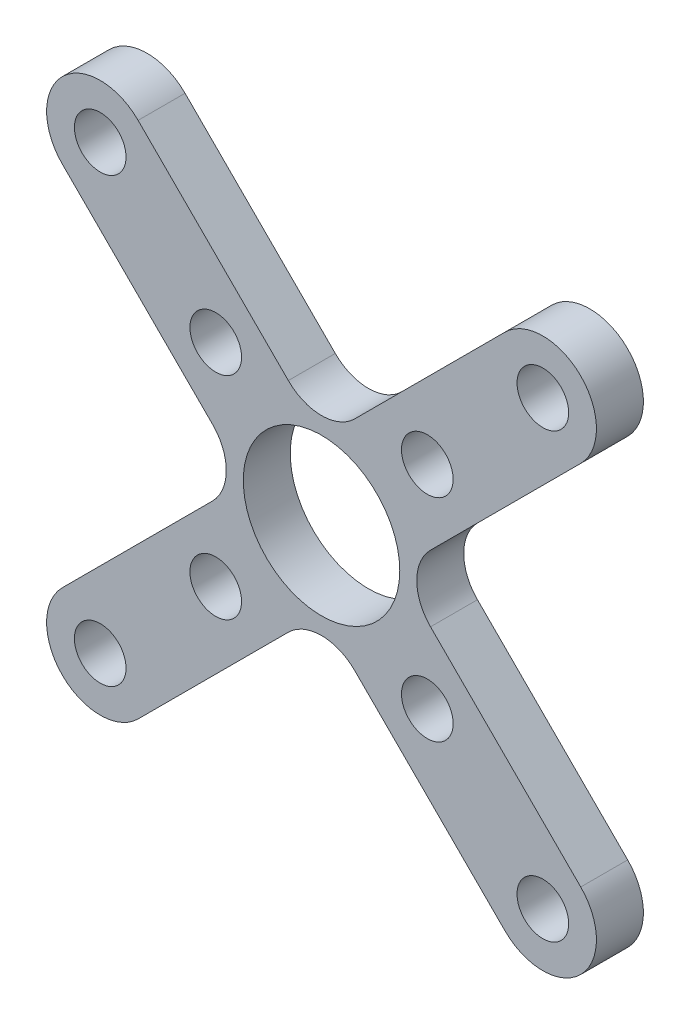
ISO-10303-21;
HEADER;
FILE_DESCRIPTION(('STEP AP214'),'2;1');
FILE_NAME('part.step','',(''),(''),'','','');
FILE_SCHEMA(('AUTOMOTIVE_DESIGN { 1 0 10303 214 1 1 1 1 }'));
ENDSEC;
DATA;
#1=APPLICATION_CONTEXT('core data for automotive mechanical design processes');
#2=APPLICATION_PROTOCOL_DEFINITION('international standard','automotive_design',2000,#1);
#3=PRODUCT_CONTEXT('',#1,'mechanical');
#4=PRODUCT('Part','Part','',(#3));
#5=PRODUCT_RELATED_PRODUCT_CATEGORY('part','',(#4));
#6=PRODUCT_DEFINITION_FORMATION('','',#4);
#7=PRODUCT_DEFINITION_CONTEXT('part definition',#1,'design');
#8=PRODUCT_DEFINITION('design','',#6,#7);
#9=PRODUCT_DEFINITION_SHAPE('','',#8);
#10=(LENGTH_UNIT() NAMED_UNIT(*) SI_UNIT(.MILLI.,.METRE.));
#11=(NAMED_UNIT(*) PLANE_ANGLE_UNIT() SI_UNIT($,.RADIAN.));
#12=(NAMED_UNIT(*) SI_UNIT($,.STERADIAN.) SOLID_ANGLE_UNIT());
#13=UNCERTAINTY_MEASURE_WITH_UNIT(LENGTH_MEASURE(1.E-05),#10,'distance_accuracy_value','');
#14=(GEOMETRIC_REPRESENTATION_CONTEXT(3) GLOBAL_UNCERTAINTY_ASSIGNED_CONTEXT((#13)) GLOBAL_UNIT_ASSIGNED_CONTEXT((#10,
#11,#12)) REPRESENTATION_CONTEXT('',''));
#15=CARTESIAN_POINT('',(0.,0.,0.));
#16=DIRECTION('',(0.,0.,1.));
#17=DIRECTION('',(1.,0.,0.));
#18=AXIS2_PLACEMENT_3D('',#15,#16,#17);
#19=CARTESIAN_POINT('',(-9.08524209264177,0.,3.));
#20=DIRECTION('',(0.,0.,-1.));
#21=DIRECTION('',(-1.,0.,0.));
#22=AXIS2_PLACEMENT_3D('',#19,#20,#21);
#23=PLANE('',#22);
#24=CARTESIAN_POINT('',(-6.75987434706719,-6.75987434706728,3.));
#25=DIRECTION('',(0.,0.,-1.));
#26=DIRECTION('',(-1.,0.,0.));
#27=AXIS2_PLACEMENT_3D('',#24,#25,#26);
#28=CIRCLE('',#27,1.65);
#29=CARTESIAN_POINT('',(-8.40987434706719,-6.75987434706728,3.));
#30=VERTEX_POINT('',#29);
#31=EDGE_CURVE('E820',#30,#30,#28,.T.);
#32=ORIENTED_EDGE('',*,*,#31,.T.);
#33=EDGE_LOOP('',(#32));
#34=FACE_BOUND('',#33,.T.);
#35=CARTESIAN_POINT('',(6.75987434706719,6.75987434706728,3.));
#36=DIRECTION('',(0.,0.,-1.));
#37=DIRECTION('',(-1.,0.,0.));
#38=AXIS2_PLACEMENT_3D('',#35,#36,#37);
#39=CIRCLE('',#38,1.65);
#40=CARTESIAN_POINT('',(5.10987434706719,6.75987434706728,3.));
#41=VERTEX_POINT('',#40);
#42=EDGE_CURVE('E834',#41,#41,#39,.T.);
#43=ORIENTED_EDGE('',*,*,#42,.T.);
#44=EDGE_LOOP('',(#43));
#45=FACE_BOUND('',#44,.T.);
#46=CARTESIAN_POINT('',(-9.08524209264177,0.,3.));
#47=DIRECTION('',(0.,0.,-1.));
#48=DIRECTION('',(-1.,0.,0.));
#49=AXIS2_PLACEMENT_3D('',#46,#47,#48);
#50=CIRCLE('',#49,3.);
#51=CARTESIAN_POINT('',(-6.96392174908201,2.12132034355962,3.));
#52=VERTEX_POINT('',#51);
#53=CARTESIAN_POINT('',(-6.9639217490821,-2.12132034355954,3.));
#54=VERTEX_POINT('',#53);
#55=EDGE_CURVE('E681',#52,#54,#50,.T.);
#56=ORIENTED_EDGE('',*,*,#55,.T.);
#57=DIRECTION('',(-0.707106781186541,-0.707106781186554,0.));
#58=VECTOR('',#57,1.);
#59=CARTESIAN_POINT('',(-6.9639217490821,-2.12132034355954,3.));
#60=LINE('',#59,#58);
#61=CARTESIAN_POINT('',(-16.5634363264922,-11.7208349209698,3.));
#62=VERTEX_POINT('',#61);
#63=EDGE_CURVE('E578',#54,#62,#60,.T.);
#64=ORIENTED_EDGE('',*,*,#63,.T.);
#65=CARTESIAN_POINT('',(-14.142135623731,-14.1421356237309,3.));
#66=DIRECTION('',(0.,0.,1.));
#67=DIRECTION('',(1.,0.,0.));
#68=AXIS2_PLACEMENT_3D('',#65,#66,#67);
#69=CIRCLE('',#68,3.42423629242906);
#70=CARTESIAN_POINT('',(-11.720833187446,-16.563434592968,3.));
#71=VERTEX_POINT('',#70);
#72=EDGE_CURVE('E713',#62,#71,#69,.T.);
#73=ORIENTED_EDGE('',*,*,#72,.T.);
#74=DIRECTION('',(-0.70710678118655,-0.707106781186545,0.));
#75=VECTOR('',#74,1.);
#76=CARTESIAN_POINT('',(-2.12132034355975,-6.96392174908287,3.));
#77=LINE('',#76,#75);
#78=CARTESIAN_POINT('',(-2.12132034355975,-6.96392174908287,3.));
#79=VERTEX_POINT('',#78);
#80=EDGE_CURVE('E726',#79,#71,#77,.T.);
#81=ORIENTED_EDGE('',*,*,#80,.F.);
#82=CARTESIAN_POINT('',(-1.11240012301255E-13,-9.08524209264252,3.));
#83=DIRECTION('',(0.,0.,-1.));
#84=DIRECTION('',(-1.,0.,0.));
#85=AXIS2_PLACEMENT_3D('',#82,#83,#84);
#86=CIRCLE('',#85,3.);
#87=CARTESIAN_POINT('',(2.12132034355965,-6.96392174908299,3.));
#88=VERTEX_POINT('',#87);
#89=EDGE_CURVE('E727',#79,#88,#86,.T.);
#90=ORIENTED_EDGE('',*,*,#89,.T.);
#91=DIRECTION('',(0.707106781186511,-0.707106781186584,0.));
#92=VECTOR('',#91,1.);
#93=CARTESIAN_POINT('',(2.12132034355965,-6.96392174908299,3.));
#94=LINE('',#93,#92);
#95=CARTESIAN_POINT('',(11.7208331874448,-16.5634345929691,3.));
#96=VERTEX_POINT('',#95);
#97=EDGE_CURVE('E729',#88,#96,#94,.T.);
#98=ORIENTED_EDGE('',*,*,#97,.T.);
#99=CARTESIAN_POINT('',(14.1421338902071,-14.1421338902071,3.));
#100=DIRECTION('',(0.,0.,-1.));
#101=DIRECTION('',(-1.,0.,0.));
#102=AXIS2_PLACEMENT_3D('',#99,#100,#101);
#103=CIRCLE('',#102,3.42423629242974);
#104=CARTESIAN_POINT('',(16.5634345929691,-11.7208331874449,3.));
#105=VERTEX_POINT('',#104);
#106=EDGE_CURVE('E735',#105,#96,#103,.T.);
#107=ORIENTED_EDGE('',*,*,#106,.F.);
#108=DIRECTION('',(0.70710678118658,-0.707106781186515,0.));
#109=VECTOR('',#108,1.);
#110=CARTESIAN_POINT('',(6.963921749083,-2.12132034355965,3.));
#111=LINE('',#110,#109);
#112=CARTESIAN_POINT('',(6.963921749083,-2.12132034355965,3.));
#113=VERTEX_POINT('',#112);
#114=EDGE_CURVE('E738',#113,#105,#111,.T.);
#115=ORIENTED_EDGE('',*,*,#114,.F.);
#116=CARTESIAN_POINT('',(9.08524209264255,1.01235817185007E-13,3.));
#117=DIRECTION('',(0.,0.,-1.));
#118=DIRECTION('',(-1.,0.,0.));
#119=AXIS2_PLACEMENT_3D('',#116,#117,#118);
#120=CIRCLE('',#119,3.00000000000001);
#121=CARTESIAN_POINT('',(6.96392174908291,2.12132034355976,3.));
#122=VERTEX_POINT('',#121);
#123=EDGE_CURVE('E741',#113,#122,#120,.T.);
#124=ORIENTED_EDGE('',*,*,#123,.T.);
#125=DIRECTION('',(-0.70710678118655,-0.707106781186545,0.));
#126=VECTOR('',#125,1.);
#127=CARTESIAN_POINT('',(16.5634345929686,11.7208331874454,3.));
#128=LINE('',#127,#126);
#129=CARTESIAN_POINT('',(16.5634345929686,11.7208331874454,3.));
#130=VERTEX_POINT('',#129);
#131=EDGE_CURVE('E743',#130,#122,#128,.T.);
#132=ORIENTED_EDGE('',*,*,#131,.F.);
#133=CARTESIAN_POINT('',(14.142135623731,14.1421356237309,3.));
#134=DIRECTION('',(0.,0.,1.));
#135=DIRECTION('',(1.,0.,0.));
#136=AXIS2_PLACEMENT_3D('',#133,#134,#135);
#137=CIRCLE('',#136,3.42423629242975);
#138=CARTESIAN_POINT('',(11.7208331874451,16.563434592968,3.));
#139=VERTEX_POINT('',#138);
#140=EDGE_CURVE('E746',#130,#139,#137,.T.);
#141=ORIENTED_EDGE('',*,*,#140,.T.);
#142=DIRECTION('',(-0.70710678118654,-0.707106781186555,0.));
#143=VECTOR('',#142,1.);
#144=CARTESIAN_POINT('',(11.7208331874451,16.563434592968,3.));
#145=LINE('',#144,#143);
#146=CARTESIAN_POINT('',(2.12132034355955,6.96392174908229,3.));
#147=VERTEX_POINT('',#146);
#148=EDGE_CURVE('E748',#139,#147,#145,.T.);
#149=ORIENTED_EDGE('',*,*,#148,.T.);
#150=CARTESIAN_POINT('',(-1.17055628364718E-13,9.08524209264191,3.));
#151=DIRECTION('',(0.,0.,-1.));
#152=DIRECTION('',(-1.,0.,0.));
#153=AXIS2_PLACEMENT_3D('',#150,#151,#152);
#154=CIRCLE('',#153,3.);
#155=CARTESIAN_POINT('',(-2.12132034355966,6.96392174908217,3.));
#156=VERTEX_POINT('',#155);
#157=EDGE_CURVE('E632',#147,#156,#154,.T.);
#158=ORIENTED_EDGE('',*,*,#157,.T.);
#159=DIRECTION('',(0.707106781186581,-0.707106781186515,0.));
#160=VECTOR('',#159,1.);
#161=CARTESIAN_POINT('',(-11.7208331874458,16.5634345929674,3.));
#162=LINE('',#161,#160);
#163=CARTESIAN_POINT('',(-11.7208331874458,16.5634345929674,3.));
#164=VERTEX_POINT('',#163);
#165=EDGE_CURVE('E620',#164,#156,#162,.T.);
#166=ORIENTED_EDGE('',*,*,#165,.F.);
#167=CARTESIAN_POINT('',(-14.1421338902065,14.1421338902066,3.));
#168=DIRECTION('',(0.,0.,-1.));
#169=DIRECTION('',(-1.,0.,0.));
#170=AXIS2_PLACEMENT_3D('',#167,#168,#169);
#171=CIRCLE('',#170,3.42423629242775);
#172=CARTESIAN_POINT('',(-16.5634345929672,11.7208331874458,3.));
#173=VERTEX_POINT('',#172);
#174=EDGE_CURVE('E630',#173,#164,#171,.T.);
#175=ORIENTED_EDGE('',*,*,#174,.F.);
#176=DIRECTION('',(0.70710678118651,-0.707106781186585,0.));
#177=VECTOR('',#176,1.);
#178=CARTESIAN_POINT('',(-16.5634345929672,11.7208331874458,3.));
#179=LINE('',#178,#177);
#180=EDGE_CURVE('E515',#173,#52,#179,.T.);
#181=ORIENTED_EDGE('',*,*,#180,.T.);
#182=EDGE_LOOP('',(#56,#64,#73,#81,#90,#98,#107,#115,#124,#132,#141,#149,#158,#166,#175,#181));
#183=FACE_BOUND('',#182,.T.);
#184=CARTESIAN_POINT('',(-14.1421338902065,14.1421338902066,3.));
#185=DIRECTION('',(0.,0.,1.));
#186=DIRECTION('',(1.,0.,0.));
#187=AXIS2_PLACEMENT_3D('',#184,#185,#186);
#188=CIRCLE('',#187,1.65);
#189=CARTESIAN_POINT('',(-12.4921338902065,14.1421338902066,3.));
#190=VERTEX_POINT('',#189);
#191=EDGE_CURVE('E645',#190,#190,#188,.T.);
#192=ORIENTED_EDGE('',*,*,#191,.F.);
#193=EDGE_LOOP('',(#192));
#194=FACE_BOUND('',#193,.T.);
#195=CARTESIAN_POINT('',(14.142135623731,14.1421356237309,3.));
#196=DIRECTION('',(0.,0.,1.));
#197=DIRECTION('',(1.,0.,0.));
#198=AXIS2_PLACEMENT_3D('',#195,#196,#197);
#199=CIRCLE('',#198,1.65);
#200=CARTESIAN_POINT('',(15.792135623731,14.1421356237309,3.));
#201=VERTEX_POINT('',#200);
#202=EDGE_CURVE('E864',#201,#201,#199,.T.);
#203=ORIENTED_EDGE('',*,*,#202,.F.);
#204=EDGE_LOOP('',(#203));
#205=FACE_BOUND('',#204,.T.);
#206=CARTESIAN_POINT('',(14.1421338902071,-14.1421338902071,3.));
#207=DIRECTION('',(0.,0.,1.));
#208=DIRECTION('',(1.,0.,0.));
#209=AXIS2_PLACEMENT_3D('',#206,#207,#208);
#210=CIRCLE('',#209,1.65);
#211=CARTESIAN_POINT('',(15.7921338902071,-14.1421338902071,3.));
#212=VERTEX_POINT('',#211);
#213=EDGE_CURVE('E858',#212,#212,#210,.T.);
#214=ORIENTED_EDGE('',*,*,#213,.F.);
#215=EDGE_LOOP('',(#214));
#216=FACE_BOUND('',#215,.T.);
#217=CARTESIAN_POINT('',(-14.142135623731,-14.1421356237309,3.));
#218=DIRECTION('',(0.,0.,1.));
#219=DIRECTION('',(1.,0.,0.));
#220=AXIS2_PLACEMENT_3D('',#217,#218,#219);
#221=CIRCLE('',#220,1.65);
#222=CARTESIAN_POINT('',(-12.492135623731,-14.1421356237309,3.));
#223=VERTEX_POINT('',#222);
#224=EDGE_CURVE('E852',#223,#223,#221,.T.);
#225=ORIENTED_EDGE('',*,*,#224,.F.);
#226=EDGE_LOOP('',(#225));
#227=FACE_BOUND('',#226,.T.);
#228=CARTESIAN_POINT('',(0.,0.,3.));
#229=DIRECTION('',(0.,0.,1.));
#230=DIRECTION('',(1.,0.,0.));
#231=AXIS2_PLACEMENT_3D('',#228,#229,#230);
#232=CIRCLE('',#231,5.);
#233=CARTESIAN_POINT('',(5.,0.,3.));
#234=VERTEX_POINT('',#233);
#235=EDGE_CURVE('E846',#234,#234,#232,.T.);
#236=ORIENTED_EDGE('',*,*,#235,.F.);
#237=EDGE_LOOP('',(#236));
#238=FACE_BOUND('',#237,.T.);
#239=CARTESIAN_POINT('',(-6.75987434706735,6.75987434706741,3.));
#240=DIRECTION('',(0.,0.,1.));
#241=DIRECTION('',(1.,0.,0.));
#242=AXIS2_PLACEMENT_3D('',#239,#240,#241);
#243=CIRCLE('',#242,1.65000000000067);
#244=CARTESIAN_POINT('',(-5.10987434706667,6.75987434706741,3.));
#245=VERTEX_POINT('',#244);
#246=EDGE_CURVE('E840',#245,#245,#243,.T.);
#247=ORIENTED_EDGE('',*,*,#246,.F.);
#248=EDGE_LOOP('',(#247));
#249=FACE_BOUND('',#248,.T.);
#250=CARTESIAN_POINT('',(6.75987434706719,-6.75987434706728,3.));
#251=DIRECTION('',(0.,0.,1.));
#252=DIRECTION('',(1.,0.,0.));
#253=AXIS2_PLACEMENT_3D('',#250,#251,#252);
#254=CIRCLE('',#253,1.65);
#255=CARTESIAN_POINT('',(8.40987434706719,-6.75987434706728,3.));
#256=VERTEX_POINT('',#255);
#257=EDGE_CURVE('E828',#256,#256,#254,.T.);
#258=ORIENTED_EDGE('',*,*,#257,.F.);
#259=EDGE_LOOP('',(#258));
#260=FACE_BOUND('',#259,.T.);
#261=ADVANCED_FACE('F498',(#34,#45,#183,#194,#205,#216,#227,#238,#249,#260),#23,.F.);
#262=CARTESIAN_POINT('',(-9.08524209264177,0.,0.));
#263=DIRECTION('',(0.,0.,-1.));
#264=DIRECTION('',(-1.,0.,0.));
#265=AXIS2_PLACEMENT_3D('',#262,#263,#264);
#266=PLANE('',#265);
#267=CARTESIAN_POINT('',(-6.75987434706719,-6.75987434706728,0.));
#268=DIRECTION('',(0.,0.,-1.));
#269=DIRECTION('',(-1.,0.,0.));
#270=AXIS2_PLACEMENT_3D('',#267,#268,#269);
#271=CIRCLE('',#270,1.65);
#272=CARTESIAN_POINT('',(-8.40987434706719,-6.75987434706728,0.));
#273=VERTEX_POINT('',#272);
#274=EDGE_CURVE('E823',#273,#273,#271,.T.);
#275=ORIENTED_EDGE('',*,*,#274,.F.);
#276=EDGE_LOOP('',(#275));
#277=FACE_BOUND('',#276,.T.);
#278=CARTESIAN_POINT('',(-6.75987434706735,6.75987434706741,0.));
#279=DIRECTION('',(0.,0.,1.));
#280=DIRECTION('',(1.,0.,0.));
#281=AXIS2_PLACEMENT_3D('',#278,#279,#280);
#282=CIRCLE('',#281,1.65000000000067);
#283=CARTESIAN_POINT('',(-5.10987434706667,6.75987434706741,0.));
#284=VERTEX_POINT('',#283);
#285=EDGE_CURVE('E837',#284,#284,#282,.T.);
#286=ORIENTED_EDGE('',*,*,#285,.T.);
#287=EDGE_LOOP('',(#286));
#288=FACE_BOUND('',#287,.T.);
#289=CARTESIAN_POINT('',(-14.142135623731,-14.1421356237309,0.));
#290=DIRECTION('',(0.,0.,1.));
#291=DIRECTION('',(1.,0.,0.));
#292=AXIS2_PLACEMENT_3D('',#289,#290,#291);
#293=CIRCLE('',#292,1.65);
#294=CARTESIAN_POINT('',(-12.492135623731,-14.1421356237309,0.));
#295=VERTEX_POINT('',#294);
#296=EDGE_CURVE('E849',#295,#295,#293,.T.);
#297=ORIENTED_EDGE('',*,*,#296,.T.);
#298=EDGE_LOOP('',(#297));
#299=FACE_BOUND('',#298,.T.);
#300=CARTESIAN_POINT('',(14.142135623731,14.1421356237309,0.));
#301=DIRECTION('',(0.,0.,1.));
#302=DIRECTION('',(1.,0.,0.));
#303=AXIS2_PLACEMENT_3D('',#300,#301,#302);
#304=CIRCLE('',#303,1.65);
#305=CARTESIAN_POINT('',(15.792135623731,14.1421356237309,0.));
#306=VERTEX_POINT('',#305);
#307=EDGE_CURVE('E861',#306,#306,#304,.T.);
#308=ORIENTED_EDGE('',*,*,#307,.T.);
#309=EDGE_LOOP('',(#308));
#310=FACE_BOUND('',#309,.T.);
#311=CARTESIAN_POINT('',(-9.08524209264177,0.,0.));
#312=DIRECTION('',(0.,0.,-1.));
#313=DIRECTION('',(-1.,0.,0.));
#314=AXIS2_PLACEMENT_3D('',#311,#312,#313);
#315=CIRCLE('',#314,3.);
#316=CARTESIAN_POINT('',(-6.96392174908201,2.12132034355962,0.));
#317=VERTEX_POINT('',#316);
#318=CARTESIAN_POINT('',(-6.9639217490821,-2.12132034355954,0.));
#319=VERTEX_POINT('',#318);
#320=EDGE_CURVE('E641',#317,#319,#315,.T.);
#321=ORIENTED_EDGE('',*,*,#320,.F.);
#322=DIRECTION('',(0.70710678118651,-0.707106781186585,0.));
#323=VECTOR('',#322,1.);
#324=CARTESIAN_POINT('',(-16.5634345929672,11.7208331874458,0.));
#325=LINE('',#324,#323);
#326=CARTESIAN_POINT('',(-16.5634345929672,11.7208331874458,0.));
#327=VERTEX_POINT('',#326);
#328=EDGE_CURVE('E570',#327,#317,#325,.T.);
#329=ORIENTED_EDGE('',*,*,#328,.F.);
#330=CARTESIAN_POINT('',(-14.1421338902065,14.1421338902066,0.));
#331=DIRECTION('',(0.,0.,-1.));
#332=DIRECTION('',(-1.,0.,0.));
#333=AXIS2_PLACEMENT_3D('',#330,#331,#332);
#334=CIRCLE('',#333,3.42423629242775);
#335=CARTESIAN_POINT('',(-11.7208331874458,16.5634345929674,0.));
#336=VERTEX_POINT('',#335);
#337=EDGE_CURVE('E678',#327,#336,#334,.T.);
#338=ORIENTED_EDGE('',*,*,#337,.T.);
#339=DIRECTION('',(0.707106781186581,-0.707106781186515,0.));
#340=VECTOR('',#339,1.);
#341=CARTESIAN_POINT('',(-11.7208331874458,16.5634345929674,0.));
#342=LINE('',#341,#340);
#343=CARTESIAN_POINT('',(-2.12132034355966,6.96392174908217,0.));
#344=VERTEX_POINT('',#343);
#345=EDGE_CURVE('E622',#336,#344,#342,.T.);
#346=ORIENTED_EDGE('',*,*,#345,.T.);
#347=CARTESIAN_POINT('',(-1.17055628364718E-13,9.08524209264191,0.));
#348=DIRECTION('',(0.,0.,-1.));
#349=DIRECTION('',(-1.,0.,0.));
#350=AXIS2_PLACEMENT_3D('',#347,#348,#349);
#351=CIRCLE('',#350,3.);
#352=CARTESIAN_POINT('',(2.12132034355955,6.96392174908229,0.));
#353=VERTEX_POINT('',#352);
#354=EDGE_CURVE('E674',#353,#344,#351,.T.);
#355=ORIENTED_EDGE('',*,*,#354,.F.);
#356=DIRECTION('',(-0.70710678118654,-0.707106781186555,0.));
#357=VECTOR('',#356,1.);
#358=CARTESIAN_POINT('',(11.7208331874451,16.563434592968,0.));
#359=LINE('',#358,#357);
#360=CARTESIAN_POINT('',(11.7208331874451,16.563434592968,0.));
#361=VERTEX_POINT('',#360);
#362=EDGE_CURVE('E672',#361,#353,#359,.T.);
#363=ORIENTED_EDGE('',*,*,#362,.F.);
#364=CARTESIAN_POINT('',(14.142135623731,14.1421356237309,0.));
#365=DIRECTION('',(0.,0.,1.));
#366=DIRECTION('',(1.,0.,0.));
#367=AXIS2_PLACEMENT_3D('',#364,#365,#366);
#368=CIRCLE('',#367,3.42423629242975);
#369=CARTESIAN_POINT('',(16.5634345929686,11.7208331874454,0.));
#370=VERTEX_POINT('',#369);
#371=EDGE_CURVE('E670',#370,#361,#368,.T.);
#372=ORIENTED_EDGE('',*,*,#371,.F.);
#373=DIRECTION('',(-0.70710678118655,-0.707106781186545,0.));
#374=VECTOR('',#373,1.);
#375=CARTESIAN_POINT('',(16.5634345929686,11.7208331874454,0.));
#376=LINE('',#375,#374);
#377=CARTESIAN_POINT('',(6.96392174908291,2.12132034355976,0.));
#378=VERTEX_POINT('',#377);
#379=EDGE_CURVE('E667',#370,#378,#376,.T.);
#380=ORIENTED_EDGE('',*,*,#379,.T.);
#381=CARTESIAN_POINT('',(9.08524209264255,1.01235817185007E-13,0.));
#382=DIRECTION('',(0.,0.,-1.));
#383=DIRECTION('',(-1.,0.,0.));
#384=AXIS2_PLACEMENT_3D('',#381,#382,#383);
#385=CIRCLE('',#384,3.00000000000001);
#386=CARTESIAN_POINT('',(6.963921749083,-2.12132034355965,0.));
#387=VERTEX_POINT('',#386);
#388=EDGE_CURVE('E664',#387,#378,#385,.T.);
#389=ORIENTED_EDGE('',*,*,#388,.F.);
#390=DIRECTION('',(0.70710678118658,-0.707106781186515,0.));
#391=VECTOR('',#390,1.);
#392=CARTESIAN_POINT('',(6.963921749083,-2.12132034355965,0.));
#393=LINE('',#392,#391);
#394=CARTESIAN_POINT('',(16.5634345929691,-11.7208331874449,0.));
#395=VERTEX_POINT('',#394);
#396=EDGE_CURVE('E661',#387,#395,#393,.T.);
#397=ORIENTED_EDGE('',*,*,#396,.T.);
#398=CARTESIAN_POINT('',(14.1421338902071,-14.1421338902071,0.));
#399=DIRECTION('',(0.,0.,-1.));
#400=DIRECTION('',(-1.,0.,0.));
#401=AXIS2_PLACEMENT_3D('',#398,#399,#400);
#402=CIRCLE('',#401,3.42423629242974);
#403=CARTESIAN_POINT('',(11.7208331874448,-16.5634345929691,0.));
#404=VERTEX_POINT('',#403);
#405=EDGE_CURVE('E658',#395,#404,#402,.T.);
#406=ORIENTED_EDGE('',*,*,#405,.T.);
#407=DIRECTION('',(0.707106781186511,-0.707106781186584,0.));
#408=VECTOR('',#407,1.);
#409=CARTESIAN_POINT('',(2.12132034355965,-6.96392174908299,0.));
#410=LINE('',#409,#408);
#411=CARTESIAN_POINT('',(2.12132034355965,-6.96392174908299,0.));
#412=VERTEX_POINT('',#411);
#413=EDGE_CURVE('E655',#412,#404,#410,.T.);
#414=ORIENTED_EDGE('',*,*,#413,.F.);
#415=CARTESIAN_POINT('',(-1.11240012301255E-13,-9.08524209264252,0.));
#416=DIRECTION('',(0.,0.,-1.));
#417=DIRECTION('',(-1.,0.,0.));
#418=AXIS2_PLACEMENT_3D('',#415,#416,#417);
#419=CIRCLE('',#418,3.);
#420=CARTESIAN_POINT('',(-2.12132034355975,-6.96392174908287,0.));
#421=VERTEX_POINT('',#420);
#422=EDGE_CURVE('E653',#421,#412,#419,.T.);
#423=ORIENTED_EDGE('',*,*,#422,.F.);
#424=DIRECTION('',(-0.70710678118655,-0.707106781186545,0.));
#425=VECTOR('',#424,1.);
#426=CARTESIAN_POINT('',(-2.12132034355975,-6.96392174908287,0.));
#427=LINE('',#426,#425);
#428=CARTESIAN_POINT('',(-11.720833187446,-16.563434592968,0.));
#429=VERTEX_POINT('',#428);
#430=EDGE_CURVE('E650',#421,#429,#427,.T.);
#431=ORIENTED_EDGE('',*,*,#430,.T.);
#432=CARTESIAN_POINT('',(-14.142135623731,-14.1421356237309,0.));
#433=DIRECTION('',(0.,0.,1.));
#434=DIRECTION('',(1.,0.,0.));
#435=AXIS2_PLACEMENT_3D('',#432,#433,#434);
#436=CIRCLE('',#435,3.42423629242906);
#437=CARTESIAN_POINT('',(-16.5634363264922,-11.7208349209698,0.));
#438=VERTEX_POINT('',#437);
#439=EDGE_CURVE('E647',#438,#429,#436,.T.);
#440=ORIENTED_EDGE('',*,*,#439,.F.);
#441=DIRECTION('',(-0.707106781186541,-0.707106781186554,0.));
#442=VECTOR('',#441,1.);
#443=CARTESIAN_POINT('',(-6.9639217490821,-2.12132034355954,0.));
#444=LINE('',#443,#442);
#445=EDGE_CURVE('E644',#319,#438,#444,.T.);
#446=ORIENTED_EDGE('',*,*,#445,.F.);
#447=EDGE_LOOP('',(#321,#329,#338,#346,#355,#363,#372,#380,#389,#397,#406,#414,#423,#431,#440,#446));
#448=FACE_BOUND('',#447,.T.);
#449=CARTESIAN_POINT('',(-14.1421338902065,14.1421338902066,0.));
#450=DIRECTION('',(0.,0.,1.));
#451=DIRECTION('',(1.,0.,0.));
#452=AXIS2_PLACEMENT_3D('',#449,#450,#451);
#453=CIRCLE('',#452,1.65);
#454=CARTESIAN_POINT('',(-12.4921338902065,14.1421338902066,0.));
#455=VERTEX_POINT('',#454);
#456=EDGE_CURVE('E867',#455,#455,#453,.T.);
#457=ORIENTED_EDGE('',*,*,#456,.T.);
#458=EDGE_LOOP('',(#457));
#459=FACE_BOUND('',#458,.T.);
#460=CARTESIAN_POINT('',(14.1421338902071,-14.1421338902071,0.));
#461=DIRECTION('',(0.,0.,1.));
#462=DIRECTION('',(1.,0.,0.));
#463=AXIS2_PLACEMENT_3D('',#460,#461,#462);
#464=CIRCLE('',#463,1.65);
#465=CARTESIAN_POINT('',(15.7921338902071,-14.1421338902071,0.));
#466=VERTEX_POINT('',#465);
#467=EDGE_CURVE('E855',#466,#466,#464,.T.);
#468=ORIENTED_EDGE('',*,*,#467,.T.);
#469=EDGE_LOOP('',(#468));
#470=FACE_BOUND('',#469,.T.);
#471=CARTESIAN_POINT('',(0.,0.,0.));
#472=DIRECTION('',(0.,0.,1.));
#473=DIRECTION('',(1.,0.,0.));
#474=AXIS2_PLACEMENT_3D('',#471,#472,#473);
#475=CIRCLE('',#474,5.);
#476=CARTESIAN_POINT('',(5.,0.,0.));
#477=VERTEX_POINT('',#476);
#478=EDGE_CURVE('E843',#477,#477,#475,.T.);
#479=ORIENTED_EDGE('',*,*,#478,.T.);
#480=EDGE_LOOP('',(#479));
#481=FACE_BOUND('',#480,.T.);
#482=CARTESIAN_POINT('',(6.75987434706719,6.75987434706728,0.));
#483=DIRECTION('',(0.,0.,-1.));
#484=DIRECTION('',(-1.,0.,0.));
#485=AXIS2_PLACEMENT_3D('',#482,#483,#484);
#486=CIRCLE('',#485,1.65);
#487=CARTESIAN_POINT('',(5.10987434706719,6.75987434706728,0.));
#488=VERTEX_POINT('',#487);
#489=EDGE_CURVE('E831',#488,#488,#486,.T.);
#490=ORIENTED_EDGE('',*,*,#489,.F.);
#491=EDGE_LOOP('',(#490));
#492=FACE_BOUND('',#491,.T.);
#493=CARTESIAN_POINT('',(6.75987434706719,-6.75987434706728,0.));
#494=DIRECTION('',(0.,0.,1.));
#495=DIRECTION('',(1.,0.,0.));
#496=AXIS2_PLACEMENT_3D('',#493,#494,#495);
#497=CIRCLE('',#496,1.65);
#498=CARTESIAN_POINT('',(8.40987434706719,-6.75987434706728,0.));
#499=VERTEX_POINT('',#498);
#500=EDGE_CURVE('E825',#499,#499,#497,.T.);
#501=ORIENTED_EDGE('',*,*,#500,.T.);
#502=EDGE_LOOP('',(#501));
#503=FACE_BOUND('',#502,.T.);
#504=ADVANCED_FACE('F716',(#277,#288,#299,#310,#448,#459,#470,#481,#492,#503),#266,.T.);
#505=CARTESIAN_POINT('',(-9.08524209264177,0.,3.));
#506=DIRECTION('',(0.,0.,-1.));
#507=DIRECTION('',(-1.,0.,0.));
#508=AXIS2_PLACEMENT_3D('',#505,#506,#507);
#509=CYLINDRICAL_SURFACE('',#508,3.);
#510=ORIENTED_EDGE('',*,*,#320,.T.);
#511=DIRECTION('',(0.,0.,-1.));
#512=VECTOR('',#511,1.);
#513=CARTESIAN_POINT('',(-6.9639217490821,-2.12132034355954,3.));
#514=LINE('',#513,#512);
#515=EDGE_CURVE('E12',#54,#319,#514,.T.);
#516=ORIENTED_EDGE('',*,*,#515,.F.);
#517=ORIENTED_EDGE('',*,*,#55,.F.);
#518=DIRECTION('',(0.,0.,-1.));
#519=VECTOR('',#518,1.);
#520=CARTESIAN_POINT('',(-6.96392174908201,2.12132034355962,3.));
#521=LINE('',#520,#519);
#522=EDGE_CURVE('E637',#52,#317,#521,.T.);
#523=ORIENTED_EDGE('',*,*,#522,.T.);
#524=EDGE_LOOP('',(#510,#516,#517,#523));
#525=FACE_BOUND('',#524,.T.);
#526=ADVANCED_FACE('F500',(#525),#509,.F.);
#527=CARTESIAN_POINT('',(-6.9639217490821,-2.12132034355954,3.));
#528=DIRECTION('',(0.707106781186554,-0.707106781186541,0.));
#529=DIRECTION('',(0.707106781186541,0.707106781186554,0.));
#530=AXIS2_PLACEMENT_3D('',#527,#528,#529);
#531=PLANE('',#530);
#532=ORIENTED_EDGE('',*,*,#445,.T.);
#533=DIRECTION('',(0.,0.,-1.));
#534=VECTOR('',#533,1.);
#535=CARTESIAN_POINT('',(-16.5634363264922,-11.7208349209698,3.));
#536=LINE('',#535,#534);
#537=EDGE_CURVE('E507',#62,#438,#536,.T.);
#538=ORIENTED_EDGE('',*,*,#537,.F.);
#539=ORIENTED_EDGE('',*,*,#63,.F.);
#540=ORIENTED_EDGE('',*,*,#515,.T.);
#541=EDGE_LOOP('',(#532,#538,#539,#540));
#542=FACE_BOUND('',#541,.T.);
#543=ADVANCED_FACE('F1073',(#542),#531,.F.);
#544=CARTESIAN_POINT('',(-14.142135623731,-14.1421356237309,3.));
#545=DIRECTION('',(0.,0.,-1.));
#546=DIRECTION('',(-1.,0.,0.));
#547=AXIS2_PLACEMENT_3D('',#544,#545,#546);
#548=CYLINDRICAL_SURFACE('',#547,3.42423629242906);
#549=ORIENTED_EDGE('',*,*,#439,.T.);
#550=DIRECTION('',(0.,0.,-1.));
#551=VECTOR('',#550,1.);
#552=CARTESIAN_POINT('',(-11.720833187446,-16.563434592968,3.));
#553=LINE('',#552,#551);
#554=EDGE_CURVE('E706',#71,#429,#553,.T.);
#555=ORIENTED_EDGE('',*,*,#554,.F.);
#556=ORIENTED_EDGE('',*,*,#72,.F.);
#557=ORIENTED_EDGE('',*,*,#537,.T.);
#558=EDGE_LOOP('',(#549,#555,#556,#557));
#559=FACE_BOUND('',#558,.T.);
#560=ADVANCED_FACE('F711',(#559),#548,.T.);
#561=CARTESIAN_POINT('',(-2.12132034355975,-6.96392174908287,3.));
#562=DIRECTION('',(0.707106781186545,-0.70710678118655,0.));
#563=DIRECTION('',(0.70710678118655,0.707106781186545,0.));
#564=AXIS2_PLACEMENT_3D('',#561,#562,#563);
#565=PLANE('',#564);
#566=ORIENTED_EDGE('',*,*,#430,.F.);
#567=DIRECTION('',(0.,0.,-1.));
#568=VECTOR('',#567,1.);
#569=CARTESIAN_POINT('',(-2.12132034355975,-6.96392174908287,3.));
#570=LINE('',#569,#568);
#571=EDGE_CURVE('E704',#79,#421,#570,.T.);
#572=ORIENTED_EDGE('',*,*,#571,.F.);
#573=ORIENTED_EDGE('',*,*,#80,.T.);
#574=ORIENTED_EDGE('',*,*,#554,.T.);
#575=EDGE_LOOP('',(#566,#572,#573,#574));
#576=FACE_BOUND('',#575,.T.);
#577=ADVANCED_FACE('F722',(#576),#565,.T.);
#578=CARTESIAN_POINT('',(-1.11240012301255E-13,-9.08524209264252,3.));
#579=DIRECTION('',(0.,0.,-1.));
#580=DIRECTION('',(-1.,0.,0.));
#581=AXIS2_PLACEMENT_3D('',#578,#579,#580);
#582=CYLINDRICAL_SURFACE('',#581,3.);
#583=ORIENTED_EDGE('',*,*,#422,.T.);
#584=DIRECTION('',(0.,0.,-1.));
#585=VECTOR('',#584,1.);
#586=CARTESIAN_POINT('',(2.12132034355965,-6.96392174908299,3.));
#587=LINE('',#586,#585);
#588=EDGE_CURVE('E701',#88,#412,#587,.T.);
#589=ORIENTED_EDGE('',*,*,#588,.F.);
#590=ORIENTED_EDGE('',*,*,#89,.F.);
#591=ORIENTED_EDGE('',*,*,#571,.T.);
#592=EDGE_LOOP('',(#583,#589,#590,#591));
#593=FACE_BOUND('',#592,.T.);
#594=ADVANCED_FACE('F1046',(#593),#582,.F.);
#595=CARTESIAN_POINT('',(2.12132034355965,-6.96392174908299,3.));
#596=DIRECTION('',(0.707106781186584,0.707106781186511,0.));
#597=DIRECTION('',(-0.707106781186511,0.707106781186584,0.));
#598=AXIS2_PLACEMENT_3D('',#595,#596,#597);
#599=PLANE('',#598);
#600=ORIENTED_EDGE('',*,*,#413,.T.);
#601=DIRECTION('',(0.,0.,-1.));
#602=VECTOR('',#601,1.);
#603=CARTESIAN_POINT('',(11.7208331874448,-16.5634345929691,3.));
#604=LINE('',#603,#602);
#605=EDGE_CURVE('E699',#96,#404,#604,.T.);
#606=ORIENTED_EDGE('',*,*,#605,.F.);
#607=ORIENTED_EDGE('',*,*,#97,.F.);
#608=ORIENTED_EDGE('',*,*,#588,.T.);
#609=EDGE_LOOP('',(#600,#606,#607,#608));
#610=FACE_BOUND('',#609,.T.);
#611=ADVANCED_FACE('F1036',(#610),#599,.F.);
#612=CARTESIAN_POINT('',(14.1421338902071,-14.1421338902071,3.));
#613=DIRECTION('',(0.,0.,-1.));
#614=DIRECTION('',(-1.,0.,0.));
#615=AXIS2_PLACEMENT_3D('',#612,#613,#614);
#616=CYLINDRICAL_SURFACE('',#615,3.42423629242974);
#617=ORIENTED_EDGE('',*,*,#405,.F.);
#618=DIRECTION('',(0.,0.,-1.));
#619=VECTOR('',#618,1.);
#620=CARTESIAN_POINT('',(16.5634345929691,-11.7208331874449,3.));
#621=LINE('',#620,#619);
#622=EDGE_CURVE('E697',#105,#395,#621,.T.);
#623=ORIENTED_EDGE('',*,*,#622,.F.);
#624=ORIENTED_EDGE('',*,*,#106,.T.);
#625=ORIENTED_EDGE('',*,*,#605,.T.);
#626=EDGE_LOOP('',(#617,#623,#624,#625));
#627=FACE_BOUND('',#626,.T.);
#628=ADVANCED_FACE('F1026',(#627),#616,.T.);
#629=CARTESIAN_POINT('',(6.963921749083,-2.12132034355965,3.));
#630=DIRECTION('',(0.707106781186515,0.70710678118658,0.));
#631=DIRECTION('',(-0.70710678118658,0.707106781186515,0.));
#632=AXIS2_PLACEMENT_3D('',#629,#630,#631);
#633=PLANE('',#632);
#634=ORIENTED_EDGE('',*,*,#396,.F.);
#635=DIRECTION('',(0.,0.,-1.));
#636=VECTOR('',#635,1.);
#637=CARTESIAN_POINT('',(6.963921749083,-2.12132034355965,3.));
#638=LINE('',#637,#636);
#639=EDGE_CURVE('E695',#113,#387,#638,.T.);
#640=ORIENTED_EDGE('',*,*,#639,.F.);
#641=ORIENTED_EDGE('',*,*,#114,.T.);
#642=ORIENTED_EDGE('',*,*,#622,.T.);
#643=EDGE_LOOP('',(#634,#640,#641,#642));
#644=FACE_BOUND('',#643,.T.);
#645=ADVANCED_FACE('F1016',(#644),#633,.T.);
#646=CARTESIAN_POINT('',(9.08524209264255,1.01235817185007E-13,3.));
#647=DIRECTION('',(0.,0.,-1.));
#648=DIRECTION('',(-1.,0.,0.));
#649=AXIS2_PLACEMENT_3D('',#646,#647,#648);
#650=CYLINDRICAL_SURFACE('',#649,3.00000000000001);
#651=ORIENTED_EDGE('',*,*,#388,.T.);
#652=DIRECTION('',(0.,0.,-1.));
#653=VECTOR('',#652,1.);
#654=CARTESIAN_POINT('',(6.96392174908291,2.12132034355976,3.));
#655=LINE('',#654,#653);
#656=EDGE_CURVE('E693',#122,#378,#655,.T.);
#657=ORIENTED_EDGE('',*,*,#656,.F.);
#658=ORIENTED_EDGE('',*,*,#123,.F.);
#659=ORIENTED_EDGE('',*,*,#639,.T.);
#660=EDGE_LOOP('',(#651,#657,#658,#659));
#661=FACE_BOUND('',#660,.T.);
#662=ADVANCED_FACE('F1006',(#661),#650,.F.);
#663=CARTESIAN_POINT('',(16.5634345929686,11.7208331874454,3.));
#664=DIRECTION('',(0.707106781186545,-0.70710678118655,0.));
#665=DIRECTION('',(0.70710678118655,0.707106781186545,0.));
#666=AXIS2_PLACEMENT_3D('',#663,#664,#665);
#667=PLANE('',#666);
#668=ORIENTED_EDGE('',*,*,#379,.F.);
#669=DIRECTION('',(0.,0.,-1.));
#670=VECTOR('',#669,1.);
#671=CARTESIAN_POINT('',(16.5634345929686,11.7208331874454,3.));
#672=LINE('',#671,#670);
#673=EDGE_CURVE('E691',#130,#370,#672,.T.);
#674=ORIENTED_EDGE('',*,*,#673,.F.);
#675=ORIENTED_EDGE('',*,*,#131,.T.);
#676=ORIENTED_EDGE('',*,*,#656,.T.);
#677=EDGE_LOOP('',(#668,#674,#675,#676));
#678=FACE_BOUND('',#677,.T.);
#679=ADVANCED_FACE('F996',(#678),#667,.T.);
#680=CARTESIAN_POINT('',(14.142135623731,14.1421356237309,3.));
#681=DIRECTION('',(0.,0.,-1.));
#682=DIRECTION('',(-1.,0.,0.));
#683=AXIS2_PLACEMENT_3D('',#680,#681,#682);
#684=CYLINDRICAL_SURFACE('',#683,3.42423629242975);
#685=ORIENTED_EDGE('',*,*,#371,.T.);
#686=DIRECTION('',(0.,0.,-1.));
#687=VECTOR('',#686,1.);
#688=CARTESIAN_POINT('',(11.7208331874451,16.563434592968,3.));
#689=LINE('',#688,#687);
#690=EDGE_CURVE('E688',#139,#361,#689,.T.);
#691=ORIENTED_EDGE('',*,*,#690,.F.);
#692=ORIENTED_EDGE('',*,*,#140,.F.);
#693=ORIENTED_EDGE('',*,*,#673,.T.);
#694=EDGE_LOOP('',(#685,#691,#692,#693));
#695=FACE_BOUND('',#694,.T.);
#696=ADVANCED_FACE('F987',(#695),#684,.T.);
#697=CARTESIAN_POINT('',(11.7208331874451,16.563434592968,3.));
#698=DIRECTION('',(0.707106781186555,-0.70710678118654,0.));
#699=DIRECTION('',(0.70710678118654,0.707106781186555,0.));
#700=AXIS2_PLACEMENT_3D('',#697,#698,#699);
#701=PLANE('',#700);
#702=ORIENTED_EDGE('',*,*,#362,.T.);
#703=DIRECTION('',(0.,0.,-1.));
#704=VECTOR('',#703,1.);
#705=CARTESIAN_POINT('',(2.12132034355955,6.96392174908229,3.));
#706=LINE('',#705,#704);
#707=EDGE_CURVE('E685',#147,#353,#706,.T.);
#708=ORIENTED_EDGE('',*,*,#707,.F.);
#709=ORIENTED_EDGE('',*,*,#148,.F.);
#710=ORIENTED_EDGE('',*,*,#690,.T.);
#711=EDGE_LOOP('',(#702,#708,#709,#710));
#712=FACE_BOUND('',#711,.T.);
#713=ADVANCED_FACE('F755',(#712),#701,.F.);
#714=CARTESIAN_POINT('',(-1.17055628364718E-13,9.08524209264191,3.));
#715=DIRECTION('',(0.,0.,-1.));
#716=DIRECTION('',(-1.,0.,0.));
#717=AXIS2_PLACEMENT_3D('',#714,#715,#716);
#718=CYLINDRICAL_SURFACE('',#717,3.);
#719=ORIENTED_EDGE('',*,*,#354,.T.);
#720=DIRECTION('',(0.,0.,-1.));
#721=VECTOR('',#720,1.);
#722=CARTESIAN_POINT('',(-2.12132034355966,6.96392174908217,3.));
#723=LINE('',#722,#721);
#724=EDGE_CURVE('E627',#156,#344,#723,.T.);
#725=ORIENTED_EDGE('',*,*,#724,.F.);
#726=ORIENTED_EDGE('',*,*,#157,.F.);
#727=ORIENTED_EDGE('',*,*,#707,.T.);
#728=EDGE_LOOP('',(#719,#725,#726,#727));
#729=FACE_BOUND('',#728,.T.);
#730=ADVANCED_FACE('F759',(#729),#718,.F.);
#731=CARTESIAN_POINT('',(-11.7208331874458,16.5634345929674,3.));
#732=DIRECTION('',(0.707106781186514,0.707106781186581,0.));
#733=DIRECTION('',(-0.707106781186581,0.707106781186514,0.));
#734=AXIS2_PLACEMENT_3D('',#731,#732,#733);
#735=PLANE('',#734);
#736=ORIENTED_EDGE('',*,*,#345,.F.);
#737=DIRECTION('',(0.,0.,-1.));
#738=VECTOR('',#737,1.);
#739=CARTESIAN_POINT('',(-11.7208331874458,16.5634345929674,3.));
#740=LINE('',#739,#738);
#741=EDGE_CURVE('E617',#164,#336,#740,.T.);
#742=ORIENTED_EDGE('',*,*,#741,.F.);
#743=ORIENTED_EDGE('',*,*,#165,.T.);
#744=ORIENTED_EDGE('',*,*,#724,.T.);
#745=EDGE_LOOP('',(#736,#742,#743,#744));
#746=FACE_BOUND('',#745,.T.);
#747=ADVANCED_FACE('F619',(#746),#735,.T.);
#748=CARTESIAN_POINT('',(-14.1421338902065,14.1421338902066,3.));
#749=DIRECTION('',(0.,0.,-1.));
#750=DIRECTION('',(-1.,0.,0.));
#751=AXIS2_PLACEMENT_3D('',#748,#749,#750);
#752=CYLINDRICAL_SURFACE('',#751,3.42423629242775);
#753=ORIENTED_EDGE('',*,*,#337,.F.);
#754=DIRECTION('',(0.,0.,-1.));
#755=VECTOR('',#754,1.);
#756=CARTESIAN_POINT('',(-16.5634345929672,11.7208331874458,3.));
#757=LINE('',#756,#755);
#758=EDGE_CURVE('E567',#173,#327,#757,.T.);
#759=ORIENTED_EDGE('',*,*,#758,.F.);
#760=ORIENTED_EDGE('',*,*,#174,.T.);
#761=ORIENTED_EDGE('',*,*,#741,.T.);
#762=EDGE_LOOP('',(#753,#759,#760,#761));
#763=FACE_BOUND('',#762,.T.);
#764=ADVANCED_FACE('F635',(#763),#752,.T.);
#765=CARTESIAN_POINT('',(-16.5634345929672,11.7208331874458,3.));
#766=DIRECTION('',(0.707106781186585,0.70710678118651,0.));
#767=DIRECTION('',(-0.70710678118651,0.707106781186585,0.));
#768=AXIS2_PLACEMENT_3D('',#765,#766,#767);
#769=PLANE('',#768);
#770=ORIENTED_EDGE('',*,*,#328,.T.);
#771=ORIENTED_EDGE('',*,*,#522,.F.);
#772=ORIENTED_EDGE('',*,*,#180,.F.);
#773=ORIENTED_EDGE('',*,*,#758,.T.);
#774=EDGE_LOOP('',(#770,#771,#772,#773));
#775=FACE_BOUND('',#774,.T.);
#776=ADVANCED_FACE('F763',(#775),#769,.F.);
#777=CARTESIAN_POINT('',(-14.1421338902065,14.1421338902066,3.));
#778=DIRECTION('',(0.,0.,-1.));
#779=DIRECTION('',(-1.,0.,0.));
#780=AXIS2_PLACEMENT_3D('',#777,#778,#779);
#781=CYLINDRICAL_SURFACE('',#780,1.65);
#782=ORIENTED_EDGE('',*,*,#191,.T.);
#783=EDGE_LOOP('',(#782));
#784=FACE_BOUND('',#783,.T.);
#785=ORIENTED_EDGE('',*,*,#456,.F.);
#786=EDGE_LOOP('',(#785));
#787=FACE_BOUND('',#786,.T.);
#788=ADVANCED_FACE('F765',(#784,#787),#781,.F.);
#789=CARTESIAN_POINT('',(14.142135623731,14.1421356237309,3.));
#790=DIRECTION('',(0.,0.,-1.));
#791=DIRECTION('',(-1.,0.,0.));
#792=AXIS2_PLACEMENT_3D('',#789,#790,#791);
#793=CYLINDRICAL_SURFACE('',#792,1.65);
#794=ORIENTED_EDGE('',*,*,#202,.T.);
#795=EDGE_LOOP('',(#794));
#796=FACE_BOUND('',#795,.T.);
#797=ORIENTED_EDGE('',*,*,#307,.F.);
#798=EDGE_LOOP('',(#797));
#799=FACE_BOUND('',#798,.T.);
#800=ADVANCED_FACE('F771',(#796,#799),#793,.F.);
#801=CARTESIAN_POINT('',(14.1421338902071,-14.1421338902071,3.));
#802=DIRECTION('',(0.,0.,-1.));
#803=DIRECTION('',(-1.,0.,0.));
#804=AXIS2_PLACEMENT_3D('',#801,#802,#803);
#805=CYLINDRICAL_SURFACE('',#804,1.65);
#806=ORIENTED_EDGE('',*,*,#213,.T.);
#807=EDGE_LOOP('',(#806));
#808=FACE_BOUND('',#807,.T.);
#809=ORIENTED_EDGE('',*,*,#467,.F.);
#810=EDGE_LOOP('',(#809));
#811=FACE_BOUND('',#810,.T.);
#812=ADVANCED_FACE('F788',(#808,#811),#805,.F.);
#813=CARTESIAN_POINT('',(-14.142135623731,-14.1421356237309,3.));
#814=DIRECTION('',(0.,0.,-1.));
#815=DIRECTION('',(-1.,0.,0.));
#816=AXIS2_PLACEMENT_3D('',#813,#814,#815);
#817=CYLINDRICAL_SURFACE('',#816,1.65);
#818=ORIENTED_EDGE('',*,*,#224,.T.);
#819=EDGE_LOOP('',(#818));
#820=FACE_BOUND('',#819,.T.);
#821=ORIENTED_EDGE('',*,*,#296,.F.);
#822=EDGE_LOOP('',(#821));
#823=FACE_BOUND('',#822,.T.);
#824=ADVANCED_FACE('F792',(#820,#823),#817,.F.);
#825=CARTESIAN_POINT('',(0.,0.,3.));
#826=DIRECTION('',(0.,0.,-1.));
#827=DIRECTION('',(-1.,0.,0.));
#828=AXIS2_PLACEMENT_3D('',#825,#826,#827);
#829=CYLINDRICAL_SURFACE('',#828,5.);
#830=ORIENTED_EDGE('',*,*,#235,.T.);
#831=EDGE_LOOP('',(#830));
#832=FACE_BOUND('',#831,.T.);
#833=ORIENTED_EDGE('',*,*,#478,.F.);
#834=EDGE_LOOP('',(#833));
#835=FACE_BOUND('',#834,.T.);
#836=ADVANCED_FACE('F796',(#832,#835),#829,.F.);
#837=CARTESIAN_POINT('',(-6.75987434706735,6.75987434706741,3.));
#838=DIRECTION('',(0.,0.,-1.));
#839=DIRECTION('',(-1.,0.,0.));
#840=AXIS2_PLACEMENT_3D('',#837,#838,#839);
#841=CYLINDRICAL_SURFACE('',#840,1.65000000000067);
#842=ORIENTED_EDGE('',*,*,#246,.T.);
#843=EDGE_LOOP('',(#842));
#844=FACE_BOUND('',#843,.T.);
#845=ORIENTED_EDGE('',*,*,#285,.F.);
#846=EDGE_LOOP('',(#845));
#847=FACE_BOUND('',#846,.T.);
#848=ADVANCED_FACE('F800',(#844,#847),#841,.F.);
#849=CARTESIAN_POINT('',(6.75987434706719,6.75987434706728,3.));
#850=DIRECTION('',(0.,0.,-1.));
#851=DIRECTION('',(-1.,0.,0.));
#852=AXIS2_PLACEMENT_3D('',#849,#850,#851);
#853=CYLINDRICAL_SURFACE('',#852,1.65);
#854=ORIENTED_EDGE('',*,*,#42,.F.);
#855=EDGE_LOOP('',(#854));
#856=FACE_BOUND('',#855,.T.);
#857=ORIENTED_EDGE('',*,*,#489,.T.);
#858=EDGE_LOOP('',(#857));
#859=FACE_BOUND('',#858,.T.);
#860=ADVANCED_FACE('F804',(#856,#859),#853,.F.);
#861=CARTESIAN_POINT('',(6.75987434706719,-6.75987434706728,3.));
#862=DIRECTION('',(0.,0.,-1.));
#863=DIRECTION('',(-1.,0.,0.));
#864=AXIS2_PLACEMENT_3D('',#861,#862,#863);
#865=CYLINDRICAL_SURFACE('',#864,1.65);
#866=ORIENTED_EDGE('',*,*,#257,.T.);
#867=EDGE_LOOP('',(#866));
#868=FACE_BOUND('',#867,.T.);
#869=ORIENTED_EDGE('',*,*,#500,.F.);
#870=EDGE_LOOP('',(#869));
#871=FACE_BOUND('',#870,.T.);
#872=ADVANCED_FACE('F808',(#868,#871),#865,.F.);
#873=CARTESIAN_POINT('',(-6.75987434706719,-6.75987434706728,3.));
#874=DIRECTION('',(0.,0.,-1.));
#875=DIRECTION('',(-1.,0.,0.));
#876=AXIS2_PLACEMENT_3D('',#873,#874,#875);
#877=CYLINDRICAL_SURFACE('',#876,1.65);
#878=ORIENTED_EDGE('',*,*,#31,.F.);
#879=EDGE_LOOP('',(#878));
#880=FACE_BOUND('',#879,.T.);
#881=ORIENTED_EDGE('',*,*,#274,.T.);
#882=EDGE_LOOP('',(#881));
#883=FACE_BOUND('',#882,.T.);
#884=ADVANCED_FACE('F812',(#880,#883),#877,.F.);
#885=CLOSED_SHELL('',(#261,#504,#526,#543,#560,#577,#594,#611,#628,#645,#662,#679,#696,#713,
#730,#747,#764,#776,#788,#800,#812,#824,#836,#848,#860,#872,#884));
#886=MANIFOLD_SOLID_BREP('B2',#885);
#887=ADVANCED_BREP_SHAPE_REPRESENTATION('',(#18,#886),#14);
#888=SHAPE_DEFINITION_REPRESENTATION(#9,#887);
ENDSEC;
END-ISO-10303-21;
